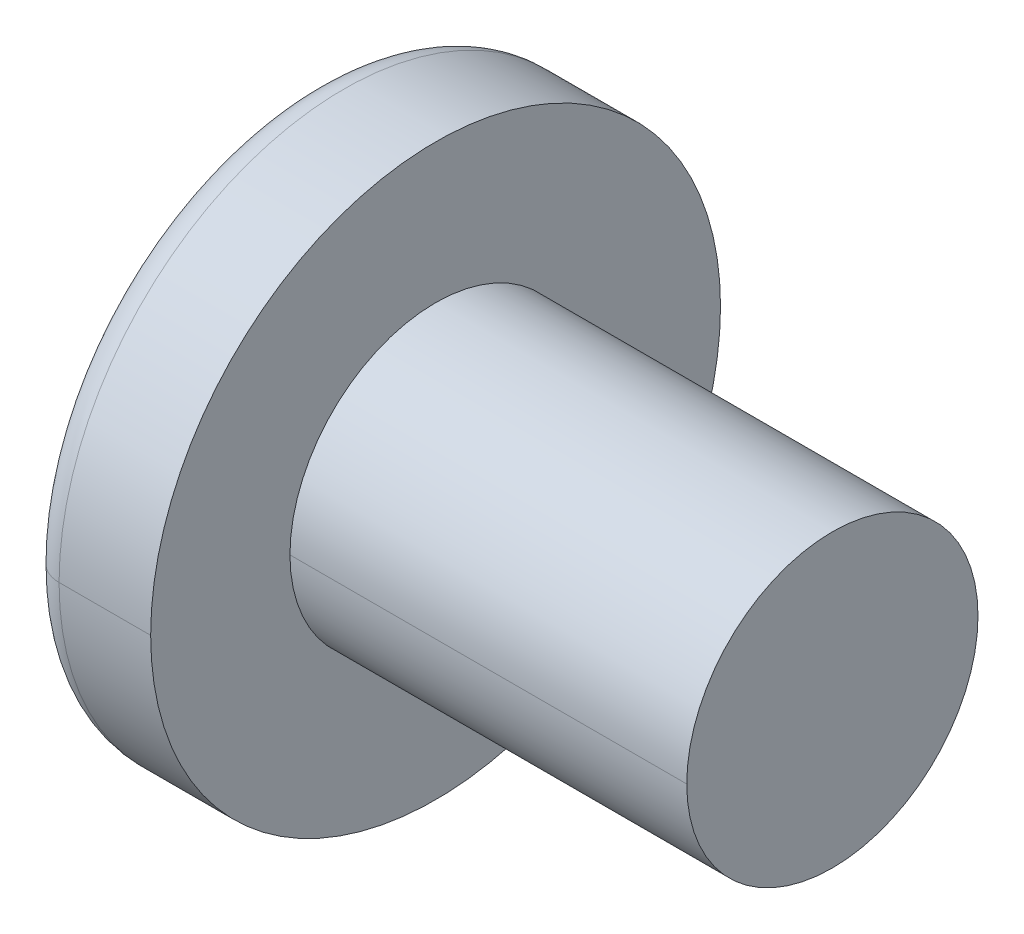
ISO-10303-21;
HEADER;
FILE_DESCRIPTION(('STEP AP214'),'2;1');
FILE_NAME('part.step','',(''),(''),'','','');
FILE_SCHEMA(('AUTOMOTIVE_DESIGN { 1 0 10303 214 1 1 1 1 }'));
ENDSEC;
DATA;
#1=APPLICATION_CONTEXT('core data for automotive mechanical design processes');
#2=APPLICATION_PROTOCOL_DEFINITION('international standard','automotive_design',2000,#1);
#3=PRODUCT_CONTEXT('',#1,'mechanical');
#4=PRODUCT('Part','Part','',(#3));
#5=PRODUCT_RELATED_PRODUCT_CATEGORY('part','',(#4));
#6=PRODUCT_DEFINITION_FORMATION('','',#4);
#7=PRODUCT_DEFINITION_CONTEXT('part definition',#1,'design');
#8=PRODUCT_DEFINITION('design','',#6,#7);
#9=PRODUCT_DEFINITION_SHAPE('','',#8);
#10=(LENGTH_UNIT() NAMED_UNIT(*) SI_UNIT(.MILLI.,.METRE.));
#11=(NAMED_UNIT(*) PLANE_ANGLE_UNIT() SI_UNIT($,.RADIAN.));
#12=(NAMED_UNIT(*) SI_UNIT($,.STERADIAN.) SOLID_ANGLE_UNIT());
#13=UNCERTAINTY_MEASURE_WITH_UNIT(LENGTH_MEASURE(1.E-05),#10,'distance_accuracy_value','');
#14=(GEOMETRIC_REPRESENTATION_CONTEXT(3) GLOBAL_UNCERTAINTY_ASSIGNED_CONTEXT((#13)) GLOBAL_UNIT_ASSIGNED_CONTEXT((#10,
#11,#12)) REPRESENTATION_CONTEXT('',''));
#15=CARTESIAN_POINT('',(0.,0.,0.));
#16=DIRECTION('',(0.,0.,1.));
#17=DIRECTION('',(1.,0.,0.));
#18=AXIS2_PLACEMENT_3D('',#15,#16,#17);
#19=CARTESIAN_POINT('',(2.72481523809524,-0.207352698412698,0.));
#20=DIRECTION('',(-0.0959099751473921,0.995390012340503,0.));
#21=DIRECTION('',(0.,0.,1.));
#22=AXIS2_PLACEMENT_3D('',#19,#20,#21);
#23=PLANE('',#22);
#24=CARTESIAN_POINT('',(5.60159094990761,0.0698366279858889,0.));
#25=DIRECTION('',(-0.0959099751473921,0.995390012340503,0.));
#26=DIRECTION('',(-0.995390012340503,-0.0959099751473921,0.));
#27=AXIS2_PLACEMENT_3D('',#24,#25,#26);
#28=CIRCLE('',#27,5.60788113173562);
#29=CARTESIAN_POINT('',(0.0388806474754116,-0.466153687613048,0.466153687613046));
#30=VERTEX_POINT('',#29);
#31=CARTESIAN_POINT('',(0.363211504948025,-0.434903058116994,1.93725306234732));
#32=VERTEX_POINT('',#31);
#33=EDGE_CURVE('E213',#30,#32,#28,.T.);
#34=ORIENTED_EDGE('',*,*,#33,.T.);
#35=DIRECTION('',(0.771012836595292,0.0742902993594444,-0.632471467519576));
#36=VECTOR('',#35,1.);
#37=CARTESIAN_POINT('',(0.,-0.469900000000008,2.2352));
#38=LINE('',#37,#36);
#39=CARTESIAN_POINT('',(2.4384,-0.23495,0.23495));
#40=VERTEX_POINT('',#39);
#41=EDGE_CURVE('E11',#32,#40,#38,.T.);
#42=ORIENTED_EDGE('',*,*,#41,.T.);
#43=DIRECTION('',(0.990843198401238,0.0954718706792862,-0.0954718706792858));
#44=VECTOR('',#43,1.);
#45=CARTESIAN_POINT('',(2.7444303168537,-0.205462703844828,0.205462703844827));
#46=LINE('',#45,#44);
#47=EDGE_CURVE('E232',#30,#40,#46,.T.);
#48=ORIENTED_EDGE('',*,*,#47,.F.);
#49=EDGE_LOOP('',(#34,#42,#48));
#50=FACE_BOUND('',#49,.T.);
#51=ADVANCED_FACE('F17',(#50),#23,.T.);
#52=CARTESIAN_POINT('',(2.72481523809524,0.207352698412698,0.));
#53=DIRECTION('',(-0.0959099751473923,-0.995390012340503,0.));
#54=DIRECTION('',(-0.995390012340503,0.0959099751473923,0.));
#55=AXIS2_PLACEMENT_3D('',#52,#53,#54);
#56=PLANE('',#55);
#57=CARTESIAN_POINT('',(5.60159094990761,-0.0698366279858896,0.));
#58=DIRECTION('',(-0.0959099751473923,-0.995390012340503,0.));
#59=DIRECTION('',(0.995390012340503,-0.0959099751473923,0.));
#60=AXIS2_PLACEMENT_3D('',#57,#58,#59);
#61=CIRCLE('',#60,5.60788113173562);
#62=CARTESIAN_POINT('',(0.363211504948025,0.43490305811698,1.93725306234733));
#63=VERTEX_POINT('',#62);
#64=CARTESIAN_POINT('',(0.0388806474754108,0.466153687613045,0.466153687613046));
#65=VERTEX_POINT('',#64);
#66=EDGE_CURVE('E239',#63,#65,#61,.T.);
#67=ORIENTED_EDGE('',*,*,#66,.T.);
#68=DIRECTION('',(-0.990843198401238,0.0954718706792857,0.0954718706792858));
#69=VECTOR('',#68,1.);
#70=CARTESIAN_POINT('',(2.7444303168537,0.205462703844826,0.205462703844827));
#71=LINE('',#70,#69);
#72=CARTESIAN_POINT('',(2.4384,0.23495,0.23495));
#73=VERTEX_POINT('',#72);
#74=EDGE_CURVE('E229',#73,#65,#71,.T.);
#75=ORIENTED_EDGE('',*,*,#74,.F.);
#76=DIRECTION('',(0.771012836595292,-0.0742902993594401,-0.632471467519576));
#77=VECTOR('',#76,1.);
#78=CARTESIAN_POINT('',(0.,0.469899999999992,2.2352));
#79=LINE('',#78,#77);
#80=EDGE_CURVE('E28',#63,#73,#79,.T.);
#81=ORIENTED_EDGE('',*,*,#80,.F.);
#82=EDGE_LOOP('',(#67,#75,#81));
#83=FACE_BOUND('',#82,.T.);
#84=ADVANCED_FACE('F19',(#83),#56,.T.);
#85=CARTESIAN_POINT('',(2.4384,-0.23495,0.23495));
#86=DIRECTION('',(0.634224045665226,0.,0.773149312810943));
#87=DIRECTION('',(0.,-1.,0.));
#88=AXIS2_PLACEMENT_3D('',#85,#86,#87);
#89=PLANE('',#88);
#90=ORIENTED_EDGE('',*,*,#80,.T.);
#91=DIRECTION('',(0.,-1.,0.));
#92=VECTOR('',#91,1.);
#93=CARTESIAN_POINT('',(2.4384,0.23495,0.23495));
#94=LINE('',#93,#92);
#95=EDGE_CURVE('E21',#73,#40,#94,.T.);
#96=ORIENTED_EDGE('',*,*,#95,.T.);
#97=ORIENTED_EDGE('',*,*,#41,.F.);
#98=CARTESIAN_POINT('',(4.4484586405925,0.,-1.41392622861104));
#99=DIRECTION('',(0.634224045665226,0.,0.773149312810943));
#100=DIRECTION('',(0.773149312810943,0.,-0.634224045665226));
#101=AXIS2_PLACEMENT_3D('',#98,#99,#100);
#102=CIRCLE('',#101,5.30177210651299);
#103=EDGE_CURVE('E217',#63,#32,#102,.T.);
#104=ORIENTED_EDGE('',*,*,#103,.F.);
#105=EDGE_LOOP('',(#90,#96,#97,#104));
#106=FACE_BOUND('',#105,.T.);
#107=ADVANCED_FACE('F660',(#106),#89,.F.);
#108=CARTESIAN_POINT('',(2.72481523809524,0.207352698412698,0.));
#109=DIRECTION('',(-0.0959099751473923,-0.995390012340503,0.));
#110=DIRECTION('',(-0.995390012340503,0.0959099751473923,0.));
#111=AXIS2_PLACEMENT_3D('',#108,#109,#110);
#112=PLANE('',#111);
#113=CARTESIAN_POINT('',(5.60159094990761,-0.0698366279858896,0.));
#114=DIRECTION('',(-0.0959099751473923,-0.995390012340503,0.));
#115=DIRECTION('',(0.995390012340503,-0.0959099751473923,0.));
#116=AXIS2_PLACEMENT_3D('',#113,#114,#115);
#117=CIRCLE('',#116,5.60788113173562);
#118=CARTESIAN_POINT('',(0.0388806474754116,0.466153687613048,-0.466153687613046));
#119=VERTEX_POINT('',#118);
#120=CARTESIAN_POINT('',(0.363211504948024,0.434903058116994,-1.93725306234732));
#121=VERTEX_POINT('',#120);
#122=EDGE_CURVE('E206',#119,#121,#117,.T.);
#123=ORIENTED_EDGE('',*,*,#122,.T.);
#124=DIRECTION('',(0.771012836595292,-0.0742902993594444,0.632471467519576));
#125=VECTOR('',#124,1.);
#126=CARTESIAN_POINT('',(0.,0.469900000000008,-2.2352));
#127=LINE('',#126,#125);
#128=CARTESIAN_POINT('',(2.4384,0.23495,-0.23495));
#129=VERTEX_POINT('',#128);
#130=EDGE_CURVE('E302',#121,#129,#127,.T.);
#131=ORIENTED_EDGE('',*,*,#130,.T.);
#132=DIRECTION('',(0.990843198401238,-0.0954718706792863,0.095471870679286));
#133=VECTOR('',#132,1.);
#134=CARTESIAN_POINT('',(2.7444303168537,0.205462703844827,-0.205462703844827));
#135=LINE('',#134,#133);
#136=EDGE_CURVE('E223',#119,#129,#135,.T.);
#137=ORIENTED_EDGE('',*,*,#136,.F.);
#138=EDGE_LOOP('',(#123,#131,#137));
#139=FACE_BOUND('',#138,.T.);
#140=ADVANCED_FACE('F655',(#139),#112,.T.);
#141=CARTESIAN_POINT('',(2.72481523809524,-0.207352698412698,0.));
#142=DIRECTION('',(-0.0959099751473921,0.995390012340503,0.));
#143=DIRECTION('',(0.,0.,1.));
#144=AXIS2_PLACEMENT_3D('',#141,#142,#143);
#145=PLANE('',#144);
#146=CARTESIAN_POINT('',(5.60159094990761,0.0698366279858889,0.));
#147=DIRECTION('',(-0.0959099751473921,0.995390012340503,0.));
#148=DIRECTION('',(-0.995390012340503,-0.0959099751473921,0.));
#149=AXIS2_PLACEMENT_3D('',#146,#147,#148);
#150=CIRCLE('',#149,5.60788113173562);
#151=CARTESIAN_POINT('',(0.363211504948023,-0.43490305811698,-1.93725306234733));
#152=VERTEX_POINT('',#151);
#153=CARTESIAN_POINT('',(0.0388806474754108,-0.466153687613044,-0.466153687613046));
#154=VERTEX_POINT('',#153);
#155=EDGE_CURVE('E187',#152,#154,#150,.T.);
#156=ORIENTED_EDGE('',*,*,#155,.T.);
#157=DIRECTION('',(-0.990843198401238,-0.0954718706792855,-0.095471870679286));
#158=VECTOR('',#157,1.);
#159=CARTESIAN_POINT('',(2.7444303168537,-0.205462703844826,-0.205462703844827));
#160=LINE('',#159,#158);
#161=CARTESIAN_POINT('',(2.4384,-0.23495,-0.23495));
#162=VERTEX_POINT('',#161);
#163=EDGE_CURVE('E224',#162,#154,#160,.T.);
#164=ORIENTED_EDGE('',*,*,#163,.F.);
#165=DIRECTION('',(0.771012836595292,0.0742902993594398,0.632471467519576));
#166=VECTOR('',#165,1.);
#167=CARTESIAN_POINT('',(0.,-0.469899999999991,-2.2352));
#168=LINE('',#167,#166);
#169=EDGE_CURVE('E300',#152,#162,#168,.T.);
#170=ORIENTED_EDGE('',*,*,#169,.F.);
#171=EDGE_LOOP('',(#156,#164,#170));
#172=FACE_BOUND('',#171,.T.);
#173=ADVANCED_FACE('F647',(#172),#145,.T.);
#174=CARTESIAN_POINT('',(2.4384,0.23495,-0.23495));
#175=DIRECTION('',(0.634224045665226,0.,-0.773149312810943));
#176=DIRECTION('',(0.,-1.,0.));
#177=AXIS2_PLACEMENT_3D('',#174,#175,#176);
#178=PLANE('',#177);
#179=ORIENTED_EDGE('',*,*,#169,.T.);
#180=DIRECTION('',(0.,1.,0.));
#181=VECTOR('',#180,1.);
#182=CARTESIAN_POINT('',(2.4384,-0.23495,-0.23495));
#183=LINE('',#182,#181);
#184=EDGE_CURVE('E243',#162,#129,#183,.T.);
#185=ORIENTED_EDGE('',*,*,#184,.T.);
#186=ORIENTED_EDGE('',*,*,#130,.F.);
#187=CARTESIAN_POINT('',(4.4484586405925,0.,1.41392622861104));
#188=DIRECTION('',(0.634224045665226,0.,-0.773149312810943));
#189=DIRECTION('',(-0.773149312810943,0.,-0.634224045665226));
#190=AXIS2_PLACEMENT_3D('',#187,#188,#189);
#191=CIRCLE('',#190,5.30177210651299);
#192=EDGE_CURVE('E191',#152,#121,#191,.T.);
#193=ORIENTED_EDGE('',*,*,#192,.F.);
#194=EDGE_LOOP('',(#179,#185,#186,#193));
#195=FACE_BOUND('',#194,.T.);
#196=ADVANCED_FACE('F637',(#195),#178,.F.);
#197=CARTESIAN_POINT('',(2.4384,-0.23495,-0.23495));
#198=DIRECTION('',(1.,0.,0.));
#199=DIRECTION('',(0.,1.,0.));
#200=AXIS2_PLACEMENT_3D('',#197,#198,#199);
#201=PLANE('',#200);
#202=ORIENTED_EDGE('',*,*,#184,.F.);
#203=DIRECTION('',(0.,0.,1.));
#204=VECTOR('',#203,1.);
#205=CARTESIAN_POINT('',(2.4384,-0.23495,-0.23495));
#206=LINE('',#205,#204);
#207=EDGE_CURVE('E240',#162,#40,#206,.T.);
#208=ORIENTED_EDGE('',*,*,#207,.T.);
#209=ORIENTED_EDGE('',*,*,#95,.F.);
#210=DIRECTION('',(0.,0.,-1.));
#211=VECTOR('',#210,1.);
#212=CARTESIAN_POINT('',(2.4384,0.23495,0.23495));
#213=LINE('',#212,#211);
#214=EDGE_CURVE('E244',#73,#129,#213,.T.);
#215=ORIENTED_EDGE('',*,*,#214,.T.);
#216=EDGE_LOOP('',(#202,#208,#209,#215));
#217=FACE_BOUND('',#216,.T.);
#218=ADVANCED_FACE('F625',(#217),#201,.F.);
#219=CARTESIAN_POINT('',(2.4384,-0.23495,-0.23495));
#220=DIRECTION('',(0.634224045665226,-0.773149312810943,0.));
#221=DIRECTION('',(0.,0.,-1.));
#222=AXIS2_PLACEMENT_3D('',#219,#220,#221);
#223=PLANE('',#222);
#224=DIRECTION('',(0.771012836595292,0.632471467519576,-0.074290299359442));
#225=VECTOR('',#224,1.);
#226=CARTESIAN_POINT('',(0.,-2.2352,0.4699));
#227=LINE('',#226,#225);
#228=CARTESIAN_POINT('',(0.363211504948023,-1.93725306234733,0.434903058116987));
#229=VERTEX_POINT('',#228);
#230=EDGE_CURVE('E233',#229,#40,#227,.T.);
#231=ORIENTED_EDGE('',*,*,#230,.T.);
#232=ORIENTED_EDGE('',*,*,#207,.F.);
#233=DIRECTION('',(0.771012836595292,0.632471467519576,0.0742902993594422));
#234=VECTOR('',#233,1.);
#235=CARTESIAN_POINT('',(0.,-2.2352,-0.4699));
#236=LINE('',#235,#234);
#237=CARTESIAN_POINT('',(0.363211504948024,-1.93725306234733,-0.434903058116987));
#238=VERTEX_POINT('',#237);
#239=EDGE_CURVE('E228',#238,#162,#236,.T.);
#240=ORIENTED_EDGE('',*,*,#239,.F.);
#241=CARTESIAN_POINT('',(4.4484586405925,1.41392622861104,0.));
#242=DIRECTION('',(0.634224045665226,-0.773149312810943,0.));
#243=DIRECTION('',(0.773149312810943,0.634224045665226,0.));
#244=AXIS2_PLACEMENT_3D('',#241,#242,#243);
#245=CIRCLE('',#244,5.30177210651299);
#246=CARTESIAN_POINT('',(0.349397179761766,-1.94858512597667,0.));
#247=VERTEX_POINT('',#246);
#248=EDGE_CURVE('E157',#247,#238,#245,.T.);
#249=ORIENTED_EDGE('',*,*,#248,.F.);
#250=CARTESIAN_POINT('',(4.4484586405925,1.41392622861104,0.));
#251=DIRECTION('',(0.634224045665226,-0.773149312810943,0.));
#252=DIRECTION('',(0.773149312810943,0.634224045665226,0.));
#253=AXIS2_PLACEMENT_3D('',#250,#251,#252);
#254=CIRCLE('',#253,5.30177210651299);
#255=EDGE_CURVE('E152',#229,#247,#254,.T.);
#256=ORIENTED_EDGE('',*,*,#255,.F.);
#257=EDGE_LOOP('',(#231,#232,#240,#249,#256));
#258=FACE_BOUND('',#257,.T.);
#259=ADVANCED_FACE('F620',(#258),#223,.F.);
#260=CARTESIAN_POINT('',(2.4384,0.23495,0.23495));
#261=DIRECTION('',(0.634224045665226,0.773149312810943,0.));
#262=DIRECTION('',(0.,0.,-1.));
#263=AXIS2_PLACEMENT_3D('',#260,#261,#262);
#264=PLANE('',#263);
#265=DIRECTION('',(0.771012836595292,-0.632471467519576,0.0742902993594423));
#266=VECTOR('',#265,1.);
#267=CARTESIAN_POINT('',(0.,2.2352,-0.4699));
#268=LINE('',#267,#266);
#269=CARTESIAN_POINT('',(0.363211504948025,1.93725306234733,-0.434903058116987));
#270=VERTEX_POINT('',#269);
#271=EDGE_CURVE('E273',#270,#129,#268,.T.);
#272=ORIENTED_EDGE('',*,*,#271,.T.);
#273=ORIENTED_EDGE('',*,*,#214,.F.);
#274=DIRECTION('',(0.771012836595292,-0.632471467519576,-0.0742902993594422));
#275=VECTOR('',#274,1.);
#276=CARTESIAN_POINT('',(0.,2.2352,0.4699));
#277=LINE('',#276,#275);
#278=CARTESIAN_POINT('',(0.363211504948025,1.93725306234733,0.434903058116987));
#279=VERTEX_POINT('',#278);
#280=EDGE_CURVE('E176',#279,#73,#277,.T.);
#281=ORIENTED_EDGE('',*,*,#280,.F.);
#282=CARTESIAN_POINT('',(4.4484586405925,-1.41392622861104,0.));
#283=DIRECTION('',(0.634224045665226,0.773149312810943,0.));
#284=DIRECTION('',(-0.773149312810943,0.634224045665226,0.));
#285=AXIS2_PLACEMENT_3D('',#282,#283,#284);
#286=CIRCLE('',#285,5.30177210651299);
#287=CARTESIAN_POINT('',(0.349397179761766,1.94858512597667,0.));
#288=VERTEX_POINT('',#287);
#289=EDGE_CURVE('E144',#288,#279,#286,.T.);
#290=ORIENTED_EDGE('',*,*,#289,.F.);
#291=CARTESIAN_POINT('',(4.4484586405925,-1.41392622861104,0.));
#292=DIRECTION('',(0.634224045665226,0.773149312810943,0.));
#293=DIRECTION('',(-0.773149312810943,0.634224045665226,0.));
#294=AXIS2_PLACEMENT_3D('',#291,#292,#293);
#295=CIRCLE('',#294,5.30177210651299);
#296=EDGE_CURVE('E265',#270,#288,#295,.T.);
#297=ORIENTED_EDGE('',*,*,#296,.F.);
#298=EDGE_LOOP('',(#272,#273,#281,#290,#297));
#299=FACE_BOUND('',#298,.T.);
#300=ADVANCED_FACE('F375',(#299),#264,.F.);
#301=CARTESIAN_POINT('',(7.239,1.7526,0.));
#302=DIRECTION('',(1.,0.,0.));
#303=DIRECTION('',(0.,1.,0.));
#304=AXIS2_PLACEMENT_3D('',#301,#302,#303);
#305=PLANE('',#304);
#306=CARTESIAN_POINT('',(7.239,0.,0.));
#307=DIRECTION('',(-1.,0.,0.));
#308=DIRECTION('',(0.,0.,1.));
#309=AXIS2_PLACEMENT_3D('',#306,#307,#308);
#310=CIRCLE('',#309,1.7526);
#311=CARTESIAN_POINT('',(7.239,0.,1.7526));
#312=VERTEX_POINT('',#311);
#313=CARTESIAN_POINT('',(7.239,0.,-1.7526));
#314=VERTEX_POINT('',#313);
#315=EDGE_CURVE('E211',#312,#314,#310,.T.);
#316=ORIENTED_EDGE('',*,*,#315,.F.);
#317=CARTESIAN_POINT('',(7.239,0.,0.));
#318=DIRECTION('',(-1.,0.,0.));
#319=DIRECTION('',(0.,0.,1.));
#320=AXIS2_PLACEMENT_3D('',#317,#318,#319);
#321=CIRCLE('',#320,1.7526);
#322=EDGE_CURVE('E186',#314,#312,#321,.T.);
#323=ORIENTED_EDGE('',*,*,#322,.F.);
#324=EDGE_LOOP('',(#316,#323));
#325=FACE_BOUND('',#324,.T.);
#326=ADVANCED_FACE('F350',(#325),#305,.T.);
#327=CARTESIAN_POINT('',(1.3616071085509,0.,0.));
#328=DIRECTION('',(-1.,0.,0.));
#329=DIRECTION('',(0.,0.,1.));
#330=AXIS2_PLACEMENT_3D('',#327,#328,#329);
#331=TOROIDAL_SURFACE('',#330,3.048,0.381);
#332=CARTESIAN_POINT('',(1.3616071085509,0.,-3.048));
#333=DIRECTION('',(0.,1.,0.));
#334=DIRECTION('',(0.,0.,1.));
#335=AXIS2_PLACEMENT_3D('',#332,#333,#334);
#336=CIRCLE('',#335,0.381);
#337=CARTESIAN_POINT('',(1.3616071085509,0.,-3.429));
#338=VERTEX_POINT('',#337);
#339=CARTESIAN_POINT('',(1.05207992987385,0.,-3.27015743440233));
#340=VERTEX_POINT('',#339);
#341=EDGE_CURVE('E196',#338,#340,#336,.T.);
#342=ORIENTED_EDGE('',*,*,#341,.F.);
#343=CARTESIAN_POINT('',(1.3616071085509,0.,0.));
#344=DIRECTION('',(-1.,0.,0.));
#345=DIRECTION('',(0.,0.,1.));
#346=AXIS2_PLACEMENT_3D('',#343,#344,#345);
#347=CIRCLE('',#346,3.429);
#348=CARTESIAN_POINT('',(1.3616071085509,0.,3.429));
#349=VERTEX_POINT('',#348);
#350=EDGE_CURVE('E256',#338,#349,#347,.T.);
#351=ORIENTED_EDGE('',*,*,#350,.T.);
#352=CARTESIAN_POINT('',(1.3616071085509,0.,3.048));
#353=DIRECTION('',(0.,-1.,0.));
#354=DIRECTION('',(0.,0.,-1.));
#355=AXIS2_PLACEMENT_3D('',#352,#353,#354);
#356=CIRCLE('',#355,0.381);
#357=CARTESIAN_POINT('',(1.05207992987385,0.,3.27015743440233));
#358=VERTEX_POINT('',#357);
#359=EDGE_CURVE('E139',#349,#358,#356,.T.);
#360=ORIENTED_EDGE('',*,*,#359,.T.);
#361=CARTESIAN_POINT('',(1.05207992987385,0.,0.));
#362=DIRECTION('',(-1.,0.,0.));
#363=DIRECTION('',(0.,0.,1.));
#364=AXIS2_PLACEMENT_3D('',#361,#362,#363);
#365=CIRCLE('',#364,3.27015743440233);
#366=CARTESIAN_POINT('',(1.05207992987385,-3.27015743440233,0.));
#367=VERTEX_POINT('',#366);
#368=EDGE_CURVE('E130',#367,#358,#365,.T.);
#369=ORIENTED_EDGE('',*,*,#368,.F.);
#370=CARTESIAN_POINT('',(1.05207992987385,0.,0.));
#371=DIRECTION('',(-1.,0.,0.));
#372=DIRECTION('',(0.,0.,1.));
#373=AXIS2_PLACEMENT_3D('',#370,#371,#372);
#374=CIRCLE('',#373,3.27015743440233);
#375=EDGE_CURVE('E135',#340,#367,#374,.T.);
#376=ORIENTED_EDGE('',*,*,#375,.F.);
#377=EDGE_LOOP('',(#342,#351,#360,#369,#376));
#378=FACE_BOUND('',#377,.T.);
#379=ADVANCED_FACE('F133',(#378),#331,.T.);
#380=CARTESIAN_POINT('',(-25.4,0.,0.));
#381=DIRECTION('',(-1.,0.,0.));
#382=DIRECTION('',(0.,0.,1.));
#383=AXIS2_PLACEMENT_3D('',#380,#381,#382);
#384=CYLINDRICAL_SURFACE('',#383,3.429);
#385=DIRECTION('',(-1.,0.,0.));
#386=VECTOR('',#385,1.);
#387=CARTESIAN_POINT('',(-25.4,0.,-3.429));
#388=LINE('',#387,#386);
#389=CARTESIAN_POINT('',(2.4638,0.,-3.429));
#390=VERTEX_POINT('',#389);
#391=EDGE_CURVE('E212',#390,#338,#388,.T.);
#392=ORIENTED_EDGE('',*,*,#391,.F.);
#393=CARTESIAN_POINT('',(2.4638,0.,0.));
#394=DIRECTION('',(-1.,0.,0.));
#395=DIRECTION('',(0.,0.,1.));
#396=AXIS2_PLACEMENT_3D('',#393,#394,#395);
#397=CIRCLE('',#396,3.429);
#398=CARTESIAN_POINT('',(2.4638,0.,3.429));
#399=VERTEX_POINT('',#398);
#400=EDGE_CURVE('E185',#390,#399,#397,.T.);
#401=ORIENTED_EDGE('',*,*,#400,.T.);
#402=DIRECTION('',(-1.,0.,0.));
#403=VECTOR('',#402,1.);
#404=CARTESIAN_POINT('',(-25.4,0.,3.429));
#405=LINE('',#404,#403);
#406=EDGE_CURVE('E207',#399,#349,#405,.T.);
#407=ORIENTED_EDGE('',*,*,#406,.T.);
#408=ORIENTED_EDGE('',*,*,#350,.F.);
#409=EDGE_LOOP('',(#392,#401,#407,#408));
#410=FACE_BOUND('',#409,.T.);
#411=ADVANCED_FACE('F567',(#410),#384,.T.);
#412=CARTESIAN_POINT('',(2.4638,1.7526,0.));
#413=DIRECTION('',(-1.,0.,0.));
#414=DIRECTION('',(0.,0.,1.));
#415=AXIS2_PLACEMENT_3D('',#412,#413,#414);
#416=PLANE('',#415);
#417=CARTESIAN_POINT('',(2.4638,0.,0.));
#418=DIRECTION('',(-1.,0.,0.));
#419=DIRECTION('',(0.,0.,1.));
#420=AXIS2_PLACEMENT_3D('',#417,#418,#419);
#421=CIRCLE('',#420,1.7526);
#422=CARTESIAN_POINT('',(2.4638,0.,1.7526));
#423=VERTEX_POINT('',#422);
#424=CARTESIAN_POINT('',(2.4638,0.,-1.7526));
#425=VERTEX_POINT('',#424);
#426=EDGE_CURVE('E172',#423,#425,#421,.T.);
#427=ORIENTED_EDGE('',*,*,#426,.T.);
#428=CARTESIAN_POINT('',(2.4638,0.,0.));
#429=DIRECTION('',(-1.,0.,0.));
#430=DIRECTION('',(0.,0.,1.));
#431=AXIS2_PLACEMENT_3D('',#428,#429,#430);
#432=CIRCLE('',#431,1.7526);
#433=EDGE_CURVE('E182',#425,#423,#432,.T.);
#434=ORIENTED_EDGE('',*,*,#433,.T.);
#435=EDGE_LOOP('',(#427,#434));
#436=FACE_BOUND('',#435,.T.);
#437=CARTESIAN_POINT('',(2.4638,0.,0.));
#438=DIRECTION('',(-1.,0.,0.));
#439=DIRECTION('',(0.,0.,1.));
#440=AXIS2_PLACEMENT_3D('',#437,#438,#439);
#441=CIRCLE('',#440,3.429);
#442=EDGE_CURVE('E290',#399,#390,#441,.T.);
#443=ORIENTED_EDGE('',*,*,#442,.F.);
#444=ORIENTED_EDGE('',*,*,#400,.F.);
#445=EDGE_LOOP('',(#443,#444));
#446=FACE_BOUND('',#445,.T.);
#447=ADVANCED_FACE('F598',(#436,#446),#416,.F.);
#448=CARTESIAN_POINT('',(-25.4,0.,0.));
#449=DIRECTION('',(-1.,0.,0.));
#450=DIRECTION('',(0.,0.,1.));
#451=AXIS2_PLACEMENT_3D('',#448,#449,#450);
#452=CYLINDRICAL_SURFACE('',#451,1.7526);
#453=DIRECTION('',(-1.,0.,0.));
#454=VECTOR('',#453,1.);
#455=CARTESIAN_POINT('',(-25.4,0.,-1.7526));
#456=LINE('',#455,#454);
#457=EDGE_CURVE('E199',#314,#425,#456,.T.);
#458=ORIENTED_EDGE('',*,*,#457,.F.);
#459=ORIENTED_EDGE('',*,*,#322,.T.);
#460=DIRECTION('',(-1.,0.,0.));
#461=VECTOR('',#460,1.);
#462=CARTESIAN_POINT('',(-25.4,0.,1.7526));
#463=LINE('',#462,#461);
#464=EDGE_CURVE('E165',#312,#423,#463,.T.);
#465=ORIENTED_EDGE('',*,*,#464,.T.);
#466=ORIENTED_EDGE('',*,*,#433,.F.);
#467=EDGE_LOOP('',(#458,#459,#465,#466));
#468=FACE_BOUND('',#467,.T.);
#469=ADVANCED_FACE('F603',(#468),#452,.T.);
#470=CARTESIAN_POINT('',(2.72481523809524,0.,0.207352698412698));
#471=DIRECTION('',(-0.0959099751473921,0.,-0.995390012340503));
#472=DIRECTION('',(-0.995390012340503,0.,0.0959099751473921));
#473=AXIS2_PLACEMENT_3D('',#470,#471,#472);
#474=PLANE('',#473);
#475=CARTESIAN_POINT('',(5.60159094990761,0.,-0.0698366279858889));
#476=DIRECTION('',(-0.0959099751473921,0.,-0.995390012340503));
#477=DIRECTION('',(-0.995390012340503,0.,0.0959099751473921));
#478=AXIS2_PLACEMENT_3D('',#475,#476,#477);
#479=CIRCLE('',#478,5.60788113173562);
#480=EDGE_CURVE('E216',#229,#30,#479,.T.);
#481=ORIENTED_EDGE('',*,*,#480,.T.);
#482=ORIENTED_EDGE('',*,*,#47,.T.);
#483=ORIENTED_EDGE('',*,*,#230,.F.);
#484=EDGE_LOOP('',(#481,#482,#483));
#485=FACE_BOUND('',#484,.T.);
#486=ADVANCED_FACE('F679',(#485),#474,.T.);
#487=CARTESIAN_POINT('',(2.72481523809524,0.,0.207352698412698));
#488=DIRECTION('',(-0.0959099751473921,0.,-0.995390012340503));
#489=DIRECTION('',(-0.995390012340503,0.,0.0959099751473921));
#490=AXIS2_PLACEMENT_3D('',#487,#488,#489);
#491=PLANE('',#490);
#492=ORIENTED_EDGE('',*,*,#280,.T.);
#493=ORIENTED_EDGE('',*,*,#74,.T.);
#494=CARTESIAN_POINT('',(5.60159094990761,0.,-0.0698366279858889));
#495=DIRECTION('',(-0.0959099751473921,0.,-0.995390012340503));
#496=DIRECTION('',(-0.995390012340503,0.,0.0959099751473921));
#497=AXIS2_PLACEMENT_3D('',#494,#495,#496);
#498=CIRCLE('',#497,5.60788113173562);
#499=EDGE_CURVE('E180',#65,#279,#498,.T.);
#500=ORIENTED_EDGE('',*,*,#499,.T.);
#501=EDGE_LOOP('',(#492,#493,#500));
#502=FACE_BOUND('',#501,.T.);
#503=ADVANCED_FACE('F591',(#502),#491,.T.);
#504=CARTESIAN_POINT('',(2.72481523809524,0.,-0.207352698412698));
#505=DIRECTION('',(-0.0959099751473923,0.,0.995390012340503));
#506=DIRECTION('',(0.,1.,0.));
#507=AXIS2_PLACEMENT_3D('',#504,#505,#506);
#508=PLANE('',#507);
#509=ORIENTED_EDGE('',*,*,#239,.T.);
#510=ORIENTED_EDGE('',*,*,#163,.T.);
#511=CARTESIAN_POINT('',(5.60159094990761,0.,0.0698366279858896));
#512=DIRECTION('',(-0.0959099751473923,0.,0.995390012340503));
#513=DIRECTION('',(0.995390012340503,0.,0.0959099751473923));
#514=AXIS2_PLACEMENT_3D('',#511,#512,#513);
#515=CIRCLE('',#514,5.60788113173562);
#516=EDGE_CURVE('E192',#154,#238,#515,.T.);
#517=ORIENTED_EDGE('',*,*,#516,.T.);
#518=EDGE_LOOP('',(#509,#510,#517));
#519=FACE_BOUND('',#518,.T.);
#520=ADVANCED_FACE('F586',(#519),#508,.T.);
#521=CARTESIAN_POINT('',(2.72481523809524,0.,-0.207352698412698));
#522=DIRECTION('',(-0.0959099751473923,0.,0.995390012340503));
#523=DIRECTION('',(0.,1.,0.));
#524=AXIS2_PLACEMENT_3D('',#521,#522,#523);
#525=PLANE('',#524);
#526=CARTESIAN_POINT('',(5.60159094990761,0.,0.0698366279858896));
#527=DIRECTION('',(-0.0959099751473923,0.,0.995390012340503));
#528=DIRECTION('',(0.995390012340503,0.,0.0959099751473923));
#529=AXIS2_PLACEMENT_3D('',#526,#527,#528);
#530=CIRCLE('',#529,5.60788113173562);
#531=EDGE_CURVE('E274',#270,#119,#530,.T.);
#532=ORIENTED_EDGE('',*,*,#531,.T.);
#533=ORIENTED_EDGE('',*,*,#136,.T.);
#534=ORIENTED_EDGE('',*,*,#271,.F.);
#535=EDGE_LOOP('',(#532,#533,#534));
#536=FACE_BOUND('',#535,.T.);
#537=ADVANCED_FACE('F579',(#536),#525,.T.);
#538=CARTESIAN_POINT('',(5.60832,0.,0.));
#539=DIRECTION('',(0.,0.,-1.));
#540=DIRECTION('',(0.,1.,0.));
#541=AXIS2_PLACEMENT_3D('',#538,#539,#540);
#542=SPHERICAL_SURFACE('',#541,5.60832);
#543=CARTESIAN_POINT('',(5.60832,0.,0.));
#544=DIRECTION('',(0.,0.,-1.));
#545=DIRECTION('',(0.,1.,0.));
#546=AXIS2_PLACEMENT_3D('',#543,#544,#545);
#547=CIRCLE('',#546,5.60832);
#548=EDGE_CURVE('E148',#367,#247,#547,.T.);
#549=ORIENTED_EDGE('',*,*,#548,.F.);
#550=ORIENTED_EDGE('',*,*,#368,.T.);
#551=CARTESIAN_POINT('',(1.05207992987385,0.,0.));
#552=DIRECTION('',(-1.,0.,0.));
#553=DIRECTION('',(0.,0.,1.));
#554=AXIS2_PLACEMENT_3D('',#551,#552,#553);
#555=CIRCLE('',#554,3.27015743440233);
#556=CARTESIAN_POINT('',(1.05207992987385,3.27015743440233,0.));
#557=VERTEX_POINT('',#556);
#558=EDGE_CURVE('E195',#358,#557,#555,.T.);
#559=ORIENTED_EDGE('',*,*,#558,.T.);
#560=CARTESIAN_POINT('',(5.60832,0.,0.));
#561=DIRECTION('',(0.,0.,1.));
#562=DIRECTION('',(1.,0.,0.));
#563=AXIS2_PLACEMENT_3D('',#560,#561,#562);
#564=CIRCLE('',#563,5.60832);
#565=EDGE_CURVE('E145',#557,#288,#564,.T.);
#566=ORIENTED_EDGE('',*,*,#565,.T.);
#567=ORIENTED_EDGE('',*,*,#289,.T.);
#568=ORIENTED_EDGE('',*,*,#499,.F.);
#569=ORIENTED_EDGE('',*,*,#66,.F.);
#570=ORIENTED_EDGE('',*,*,#103,.T.);
#571=ORIENTED_EDGE('',*,*,#33,.F.);
#572=ORIENTED_EDGE('',*,*,#480,.F.);
#573=ORIENTED_EDGE('',*,*,#255,.T.);
#574=EDGE_LOOP('',(#549,#550,#559,#566,#567,#568,#569,#570,#571,#572,#573));
#575=FACE_BOUND('',#574,.T.);
#576=ADVANCED_FACE('F149',(#575),#542,.T.);
#577=CARTESIAN_POINT('',(5.60832,0.,0.));
#578=DIRECTION('',(0.,0.,-1.));
#579=DIRECTION('',(0.,1.,0.));
#580=AXIS2_PLACEMENT_3D('',#577,#578,#579);
#581=SPHERICAL_SURFACE('',#580,5.60832);
#582=CARTESIAN_POINT('',(1.05207992987385,0.,0.));
#583=DIRECTION('',(-1.,0.,0.));
#584=DIRECTION('',(0.,0.,1.));
#585=AXIS2_PLACEMENT_3D('',#582,#583,#584);
#586=CIRCLE('',#585,3.27015743440233);
#587=EDGE_CURVE('E162',#557,#340,#586,.T.);
#588=ORIENTED_EDGE('',*,*,#587,.T.);
#589=ORIENTED_EDGE('',*,*,#375,.T.);
#590=ORIENTED_EDGE('',*,*,#548,.T.);
#591=ORIENTED_EDGE('',*,*,#248,.T.);
#592=ORIENTED_EDGE('',*,*,#516,.F.);
#593=ORIENTED_EDGE('',*,*,#155,.F.);
#594=ORIENTED_EDGE('',*,*,#192,.T.);
#595=ORIENTED_EDGE('',*,*,#122,.F.);
#596=ORIENTED_EDGE('',*,*,#531,.F.);
#597=ORIENTED_EDGE('',*,*,#296,.T.);
#598=ORIENTED_EDGE('',*,*,#565,.F.);
#599=EDGE_LOOP('',(#588,#589,#590,#591,#592,#593,#594,#595,#596,#597,#598));
#600=FACE_BOUND('',#599,.T.);
#601=ADVANCED_FACE('F159',(#600),#581,.T.);
#602=CARTESIAN_POINT('',(-25.4,0.,0.));
#603=DIRECTION('',(-1.,0.,0.));
#604=DIRECTION('',(0.,0.,1.));
#605=AXIS2_PLACEMENT_3D('',#602,#603,#604);
#606=CYLINDRICAL_SURFACE('',#605,1.7526);
#607=ORIENTED_EDGE('',*,*,#315,.T.);
#608=ORIENTED_EDGE('',*,*,#457,.T.);
#609=ORIENTED_EDGE('',*,*,#426,.F.);
#610=ORIENTED_EDGE('',*,*,#464,.F.);
#611=EDGE_LOOP('',(#607,#608,#609,#610));
#612=FACE_BOUND('',#611,.T.);
#613=ADVANCED_FACE('F346',(#612),#606,.T.);
#614=CARTESIAN_POINT('',(-25.4,0.,0.));
#615=DIRECTION('',(-1.,0.,0.));
#616=DIRECTION('',(0.,0.,1.));
#617=AXIS2_PLACEMENT_3D('',#614,#615,#616);
#618=CYLINDRICAL_SURFACE('',#617,3.429);
#619=ORIENTED_EDGE('',*,*,#442,.T.);
#620=ORIENTED_EDGE('',*,*,#391,.T.);
#621=CARTESIAN_POINT('',(1.3616071085509,0.,0.));
#622=DIRECTION('',(-1.,0.,0.));
#623=DIRECTION('',(0.,0.,1.));
#624=AXIS2_PLACEMENT_3D('',#621,#622,#623);
#625=CIRCLE('',#624,3.429);
#626=EDGE_CURVE('E278',#349,#338,#625,.T.);
#627=ORIENTED_EDGE('',*,*,#626,.F.);
#628=ORIENTED_EDGE('',*,*,#406,.F.);
#629=EDGE_LOOP('',(#619,#620,#627,#628));
#630=FACE_BOUND('',#629,.T.);
#631=ADVANCED_FACE('F555',(#630),#618,.T.);
#632=CARTESIAN_POINT('',(1.3616071085509,0.,0.));
#633=DIRECTION('',(-1.,0.,0.));
#634=DIRECTION('',(0.,0.,1.));
#635=AXIS2_PLACEMENT_3D('',#632,#633,#634);
#636=TOROIDAL_SURFACE('',#635,3.048,0.381);
#637=ORIENTED_EDGE('',*,*,#626,.T.);
#638=ORIENTED_EDGE('',*,*,#341,.T.);
#639=ORIENTED_EDGE('',*,*,#587,.F.);
#640=ORIENTED_EDGE('',*,*,#558,.F.);
#641=ORIENTED_EDGE('',*,*,#359,.F.);
#642=EDGE_LOOP('',(#637,#638,#639,#640,#641));
#643=FACE_BOUND('',#642,.T.);
#644=ADVANCED_FACE('F705',(#643),#636,.T.);
#645=CLOSED_SHELL('',(#51,#84,#107,#140,#173,#196,#218,#259,#300,#326,#379,#411,#447,#469,#486,
#503,#520,#537,#576,#601,#613,#631,#644));
#646=MANIFOLD_SOLID_BREP('B1',#645);
#647=ADVANCED_BREP_SHAPE_REPRESENTATION('',(#18,#646),#14);
#648=SHAPE_DEFINITION_REPRESENTATION(#9,#647);
ENDSEC;
END-ISO-10303-21;
